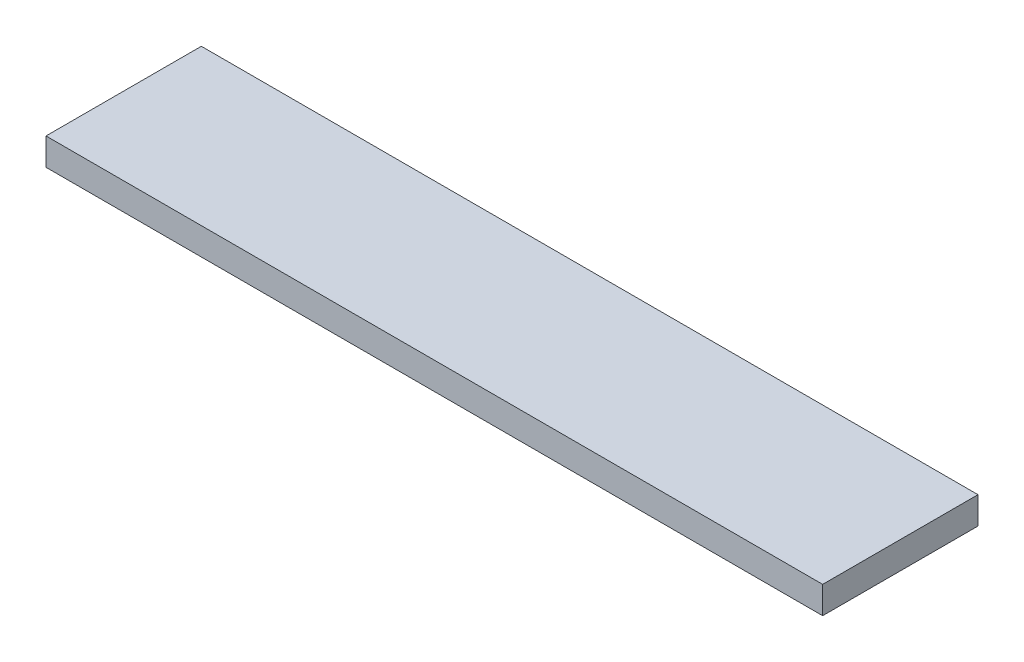
ISO-10303-21;
HEADER;
FILE_DESCRIPTION(('STEP AP214'),'2;1');
FILE_NAME('part.step','',(''),(''),'','','');
FILE_SCHEMA(('AUTOMOTIVE_DESIGN { 1 0 10303 214 1 1 1 1 }'));
ENDSEC;
DATA;
#1=APPLICATION_CONTEXT('core data for automotive mechanical design processes');
#2=APPLICATION_PROTOCOL_DEFINITION('international standard','automotive_design',2000,#1);
#3=PRODUCT_CONTEXT('',#1,'mechanical');
#4=PRODUCT('Part','Part','',(#3));
#5=PRODUCT_RELATED_PRODUCT_CATEGORY('part','',(#4));
#6=PRODUCT_DEFINITION_FORMATION('','',#4);
#7=PRODUCT_DEFINITION_CONTEXT('part definition',#1,'design');
#8=PRODUCT_DEFINITION('design','',#6,#7);
#9=PRODUCT_DEFINITION_SHAPE('','',#8);
#10=(LENGTH_UNIT() NAMED_UNIT(*) SI_UNIT(.MILLI.,.METRE.));
#11=(NAMED_UNIT(*) PLANE_ANGLE_UNIT() SI_UNIT($,.RADIAN.));
#12=(NAMED_UNIT(*) SI_UNIT($,.STERADIAN.) SOLID_ANGLE_UNIT());
#13=UNCERTAINTY_MEASURE_WITH_UNIT(LENGTH_MEASURE(1.E-05),#10,'distance_accuracy_value','');
#14=(GEOMETRIC_REPRESENTATION_CONTEXT(3) GLOBAL_UNCERTAINTY_ASSIGNED_CONTEXT((#13)) GLOBAL_UNIT_ASSIGNED_CONTEXT((#10,
#11,#12)) REPRESENTATION_CONTEXT('',''));
#15=CARTESIAN_POINT('',(0.,0.,0.));
#16=DIRECTION('',(0.,0.,1.));
#17=DIRECTION('',(1.,0.,0.));
#18=AXIS2_PLACEMENT_3D('',#15,#16,#17);
#19=CARTESIAN_POINT('',(200.,3.5,-20.));
#20=DIRECTION('',(0.,0.,1.));
#21=DIRECTION('',(0.,-1.,0.));
#22=AXIS2_PLACEMENT_3D('',#19,#20,#21);
#23=PLANE('',#22);
#24=DIRECTION('',(0.,1.,0.));
#25=VECTOR('',#24,1.);
#26=CARTESIAN_POINT('',(0.,3.5,-20.));
#27=LINE('',#26,#25);
#28=CARTESIAN_POINT('',(0.,-3.5,-20.));
#29=VERTEX_POINT('',#28);
#30=CARTESIAN_POINT('',(0.,3.5,-20.));
#31=VERTEX_POINT('',#30);
#32=EDGE_CURVE('E111',#29,#31,#27,.T.);
#33=ORIENTED_EDGE('',*,*,#32,.T.);
#34=DIRECTION('',(-1.,0.,0.));
#35=VECTOR('',#34,1.);
#36=CARTESIAN_POINT('',(200.,3.5,-20.));
#37=LINE('',#36,#35);
#38=CARTESIAN_POINT('',(200.,3.5,-20.));
#39=VERTEX_POINT('',#38);
#40=EDGE_CURVE('E11',#39,#31,#37,.T.);
#41=ORIENTED_EDGE('',*,*,#40,.F.);
#42=DIRECTION('',(0.,1.,0.));
#43=VECTOR('',#42,1.);
#44=CARTESIAN_POINT('',(200.,3.5,-20.));
#45=LINE('',#44,#43);
#46=CARTESIAN_POINT('',(200.,-3.5,-20.));
#47=VERTEX_POINT('',#46);
#48=EDGE_CURVE('E95',#47,#39,#45,.T.);
#49=ORIENTED_EDGE('',*,*,#48,.F.);
#50=DIRECTION('',(-1.,0.,0.));
#51=VECTOR('',#50,1.);
#52=CARTESIAN_POINT('',(200.,-3.5,-20.));
#53=LINE('',#52,#51);
#54=EDGE_CURVE('E107',#47,#29,#53,.T.);
#55=ORIENTED_EDGE('',*,*,#54,.T.);
#56=EDGE_LOOP('',(#33,#41,#49,#55));
#57=FACE_BOUND('',#56,.T.);
#58=ADVANCED_FACE('F43',(#57),#23,.F.);
#59=CARTESIAN_POINT('',(200.,3.5,20.));
#60=DIRECTION('',(0.,-1.,0.));
#61=DIRECTION('',(0.,0.,-1.));
#62=AXIS2_PLACEMENT_3D('',#59,#60,#61);
#63=PLANE('',#62);
#64=DIRECTION('',(0.,0.,1.));
#65=VECTOR('',#64,1.);
#66=CARTESIAN_POINT('',(0.,3.5,20.));
#67=LINE('',#66,#65);
#68=CARTESIAN_POINT('',(0.,3.5,20.));
#69=VERTEX_POINT('',#68);
#70=EDGE_CURVE('E100',#31,#69,#67,.T.);
#71=ORIENTED_EDGE('',*,*,#70,.T.);
#72=DIRECTION('',(-1.,0.,0.));
#73=VECTOR('',#72,1.);
#74=CARTESIAN_POINT('',(200.,3.5,20.));
#75=LINE('',#74,#73);
#76=CARTESIAN_POINT('',(200.,3.5,20.));
#77=VERTEX_POINT('',#76);
#78=EDGE_CURVE('E52',#77,#69,#75,.T.);
#79=ORIENTED_EDGE('',*,*,#78,.F.);
#80=DIRECTION('',(0.,0.,1.));
#81=VECTOR('',#80,1.);
#82=CARTESIAN_POINT('',(200.,3.5,20.));
#83=LINE('',#82,#81);
#84=EDGE_CURVE('E90',#39,#77,#83,.T.);
#85=ORIENTED_EDGE('',*,*,#84,.F.);
#86=ORIENTED_EDGE('',*,*,#40,.T.);
#87=EDGE_LOOP('',(#71,#79,#85,#86));
#88=FACE_BOUND('',#87,.T.);
#89=ADVANCED_FACE('F99',(#88),#63,.F.);
#90=CARTESIAN_POINT('',(200.,3.5,20.));
#91=DIRECTION('',(0.,0.,-1.));
#92=DIRECTION('',(-1.,0.,0.));
#93=AXIS2_PLACEMENT_3D('',#90,#91,#92);
#94=PLANE('',#93);
#95=DIRECTION('',(0.,-1.,0.));
#96=VECTOR('',#95,1.);
#97=CARTESIAN_POINT('',(0.,3.5,20.));
#98=LINE('',#97,#96);
#99=CARTESIAN_POINT('',(0.,-3.5,20.));
#100=VERTEX_POINT('',#99);
#101=EDGE_CURVE('E77',#69,#100,#98,.T.);
#102=ORIENTED_EDGE('',*,*,#101,.T.);
#103=DIRECTION('',(-1.,0.,0.));
#104=VECTOR('',#103,1.);
#105=CARTESIAN_POINT('',(200.,-3.5,20.));
#106=LINE('',#105,#104);
#107=CARTESIAN_POINT('',(200.,-3.5,20.));
#108=VERTEX_POINT('',#107);
#109=EDGE_CURVE('E102',#108,#100,#106,.T.);
#110=ORIENTED_EDGE('',*,*,#109,.F.);
#111=DIRECTION('',(0.,-1.,0.));
#112=VECTOR('',#111,1.);
#113=CARTESIAN_POINT('',(200.,3.5,20.));
#114=LINE('',#113,#112);
#115=EDGE_CURVE('E93',#77,#108,#114,.T.);
#116=ORIENTED_EDGE('',*,*,#115,.F.);
#117=ORIENTED_EDGE('',*,*,#78,.T.);
#118=EDGE_LOOP('',(#102,#110,#116,#117));
#119=FACE_BOUND('',#118,.T.);
#120=ADVANCED_FACE('F103',(#119),#94,.F.);
#121=CARTESIAN_POINT('',(200.,-3.5,20.));
#122=DIRECTION('',(0.,1.,0.));
#123=DIRECTION('',(0.,0.,1.));
#124=AXIS2_PLACEMENT_3D('',#121,#122,#123);
#125=PLANE('',#124);
#126=DIRECTION('',(0.,0.,-1.));
#127=VECTOR('',#126,1.);
#128=CARTESIAN_POINT('',(0.,-3.5,20.));
#129=LINE('',#128,#127);
#130=EDGE_CURVE('E83',#100,#29,#129,.T.);
#131=ORIENTED_EDGE('',*,*,#130,.T.);
#132=ORIENTED_EDGE('',*,*,#54,.F.);
#133=DIRECTION('',(0.,0.,-1.));
#134=VECTOR('',#133,1.);
#135=CARTESIAN_POINT('',(200.,-3.5,20.));
#136=LINE('',#135,#134);
#137=EDGE_CURVE('E60',#108,#47,#136,.T.);
#138=ORIENTED_EDGE('',*,*,#137,.F.);
#139=ORIENTED_EDGE('',*,*,#109,.T.);
#140=EDGE_LOOP('',(#131,#132,#138,#139));
#141=FACE_BOUND('',#140,.T.);
#142=ADVANCED_FACE('F124',(#141),#125,.F.);
#143=CARTESIAN_POINT('',(200.,0.,0.));
#144=DIRECTION('',(1.,0.,0.));
#145=DIRECTION('',(0.,0.,-1.));
#146=AXIS2_PLACEMENT_3D('',#143,#144,#145);
#147=PLANE('',#146);
#148=ORIENTED_EDGE('',*,*,#48,.T.);
#149=ORIENTED_EDGE('',*,*,#84,.T.);
#150=ORIENTED_EDGE('',*,*,#115,.T.);
#151=ORIENTED_EDGE('',*,*,#137,.T.);
#152=EDGE_LOOP('',(#148,#149,#150,#151));
#153=FACE_BOUND('',#152,.T.);
#154=ADVANCED_FACE('F91',(#153),#147,.T.);
#155=CARTESIAN_POINT('',(0.,0.,0.));
#156=DIRECTION('',(1.,0.,0.));
#157=DIRECTION('',(0.,0.,-1.));
#158=AXIS2_PLACEMENT_3D('',#155,#156,#157);
#159=PLANE('',#158);
#160=ORIENTED_EDGE('',*,*,#32,.F.);
#161=ORIENTED_EDGE('',*,*,#130,.F.);
#162=ORIENTED_EDGE('',*,*,#101,.F.);
#163=ORIENTED_EDGE('',*,*,#70,.F.);
#164=EDGE_LOOP('',(#160,#161,#162,#163));
#165=FACE_BOUND('',#164,.T.);
#166=ADVANCED_FACE('F127',(#165),#159,.F.);
#167=CLOSED_SHELL('',(#58,#89,#120,#142,#154,#166));
#168=MANIFOLD_SOLID_BREP('B2',#167);
#169=ADVANCED_BREP_SHAPE_REPRESENTATION('',(#18,#168),#14);
#170=SHAPE_DEFINITION_REPRESENTATION(#9,#169);
ENDSEC;
END-ISO-10303-21;
